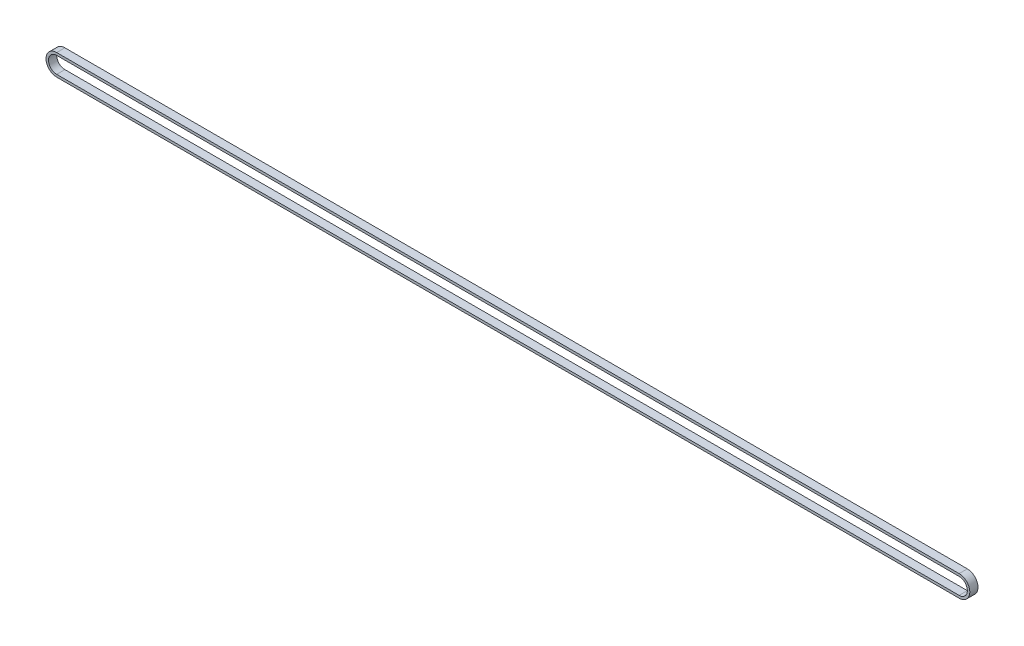
ISO-10303-21;
HEADER;
FILE_DESCRIPTION(('STEP AP214'),'2;1');
FILE_NAME('part.step','',(''),(''),'','','');
FILE_SCHEMA(('AUTOMOTIVE_DESIGN { 1 0 10303 214 1 1 1 1 }'));
ENDSEC;
DATA;
#1=APPLICATION_CONTEXT('core data for automotive mechanical design processes');
#2=APPLICATION_PROTOCOL_DEFINITION('international standard','automotive_design',2000,#1);
#3=PRODUCT_CONTEXT('',#1,'mechanical');
#4=PRODUCT('Part','Part','',(#3));
#5=PRODUCT_RELATED_PRODUCT_CATEGORY('part','',(#4));
#6=PRODUCT_DEFINITION_FORMATION('','',#4);
#7=PRODUCT_DEFINITION_CONTEXT('part definition',#1,'design');
#8=PRODUCT_DEFINITION('design','',#6,#7);
#9=PRODUCT_DEFINITION_SHAPE('','',#8);
#10=(LENGTH_UNIT() NAMED_UNIT(*) SI_UNIT(.MILLI.,.METRE.));
#11=(NAMED_UNIT(*) PLANE_ANGLE_UNIT() SI_UNIT($,.RADIAN.));
#12=(NAMED_UNIT(*) SI_UNIT($,.STERADIAN.) SOLID_ANGLE_UNIT());
#13=UNCERTAINTY_MEASURE_WITH_UNIT(LENGTH_MEASURE(1.E-05),#10,'distance_accuracy_value','');
#14=(GEOMETRIC_REPRESENTATION_CONTEXT(3) GLOBAL_UNCERTAINTY_ASSIGNED_CONTEXT((#13)) GLOBAL_UNIT_ASSIGNED_CONTEXT((#10,
#11,#12)) REPRESENTATION_CONTEXT('',''));
#15=CARTESIAN_POINT('',(0.,0.,0.));
#16=DIRECTION('',(0.,0.,1.));
#17=DIRECTION('',(1.,0.,0.));
#18=AXIS2_PLACEMENT_3D('',#15,#16,#17);
#19=CARTESIAN_POINT('',(-550.,0.,10.));
#20=DIRECTION('',(0.,0.,1.));
#21=DIRECTION('',(1.,0.,0.));
#22=AXIS2_PLACEMENT_3D('',#19,#20,#21);
#23=PLANE('',#22);
#24=CARTESIAN_POINT('',(-550.,0.,10.));
#25=DIRECTION('',(0.,0.,1.));
#26=DIRECTION('',(1.,0.,0.));
#27=AXIS2_PLACEMENT_3D('',#24,#25,#26);
#28=CIRCLE('',#27,13.);
#29=CARTESIAN_POINT('',(-550.,12.9999999999962,10.));
#30=VERTEX_POINT('',#29);
#31=CARTESIAN_POINT('',(-550.000000367736,-13.0000000000038,10.));
#32=VERTEX_POINT('',#31);
#33=EDGE_CURVE('E153',#30,#32,#28,.T.);
#34=ORIENTED_EDGE('',*,*,#33,.T.);
#35=DIRECTION('',(1.,0.,0.));
#36=VECTOR('',#35,1.);
#37=CARTESIAN_POINT('',(-550.000000367736,-13.0000000000038,10.));
#38=LINE('',#37,#36);
#39=CARTESIAN_POINT('',(550.000000478057,-12.9999999999981,10.));
#40=VERTEX_POINT('',#39);
#41=EDGE_CURVE('E157',#32,#40,#38,.T.);
#42=ORIENTED_EDGE('',*,*,#41,.T.);
#43=CARTESIAN_POINT('',(550.,0.,10.));
#44=DIRECTION('',(0.,0.,1.));
#45=DIRECTION('',(1.,0.,0.));
#46=AXIS2_PLACEMENT_3D('',#43,#44,#45);
#47=CIRCLE('',#46,12.9999999999981);
#48=CARTESIAN_POINT('',(550.,12.9999999999962,10.));
#49=VERTEX_POINT('',#48);
#50=EDGE_CURVE('E161',#40,#49,#47,.T.);
#51=ORIENTED_EDGE('',*,*,#50,.T.);
#52=DIRECTION('',(-1.,0.,0.));
#53=VECTOR('',#52,1.);
#54=CARTESIAN_POINT('',(-550.,12.9999999999962,10.));
#55=LINE('',#54,#53);
#56=EDGE_CURVE('E164',#49,#30,#55,.T.);
#57=ORIENTED_EDGE('',*,*,#56,.T.);
#58=EDGE_LOOP('',(#34,#42,#51,#57));
#59=FACE_BOUND('',#58,.T.);
#60=DIRECTION('',(1.,0.,0.));
#61=VECTOR('',#60,1.);
#62=CARTESIAN_POINT('',(-550.000000367736,-10.0000000000038,10.));
#63=LINE('',#62,#61);
#64=CARTESIAN_POINT('',(-550.000000367736,-10.0000000000038,10.));
#65=VERTEX_POINT('',#64);
#66=CARTESIAN_POINT('',(550.000000367736,-10.0000000000038,10.));
#67=VERTEX_POINT('',#66);
#68=EDGE_CURVE('E114',#65,#67,#63,.T.);
#69=ORIENTED_EDGE('',*,*,#68,.F.);
#70=CARTESIAN_POINT('',(-550.,0.,10.));
#71=DIRECTION('',(0.,0.,1.));
#72=DIRECTION('',(1.,0.,0.));
#73=AXIS2_PLACEMENT_3D('',#70,#71,#72);
#74=CIRCLE('',#73,10.);
#75=CARTESIAN_POINT('',(-550.,9.99999999999622,10.));
#76=VERTEX_POINT('',#75);
#77=EDGE_CURVE('E105',#76,#65,#74,.T.);
#78=ORIENTED_EDGE('',*,*,#77,.F.);
#79=DIRECTION('',(-1.,0.,0.));
#80=VECTOR('',#79,1.);
#81=CARTESIAN_POINT('',(-550.,9.99999999999622,10.));
#82=LINE('',#81,#80);
#83=CARTESIAN_POINT('',(550.,9.99999999999624,10.));
#84=VERTEX_POINT('',#83);
#85=EDGE_CURVE('E131',#84,#76,#82,.T.);
#86=ORIENTED_EDGE('',*,*,#85,.F.);
#87=CARTESIAN_POINT('',(550.,0.,10.));
#88=DIRECTION('',(0.,0.,1.));
#89=DIRECTION('',(1.,0.,0.));
#90=AXIS2_PLACEMENT_3D('',#87,#88,#89);
#91=CIRCLE('',#90,10.);
#92=EDGE_CURVE('E127',#67,#84,#91,.T.);
#93=ORIENTED_EDGE('',*,*,#92,.F.);
#94=EDGE_LOOP('',(#69,#78,#86,#93));
#95=FACE_BOUND('',#94,.T.);
#96=ADVANCED_FACE('F39',(#59,#95),#23,.T.);
#97=CARTESIAN_POINT('',(-550.,0.,0.));
#98=DIRECTION('',(0.,0.,1.));
#99=DIRECTION('',(1.,0.,0.));
#100=AXIS2_PLACEMENT_3D('',#97,#98,#99);
#101=PLANE('',#100);
#102=CARTESIAN_POINT('',(-550.,0.,0.));
#103=DIRECTION('',(0.,0.,1.));
#104=DIRECTION('',(1.,0.,0.));
#105=AXIS2_PLACEMENT_3D('',#102,#103,#104);
#106=CIRCLE('',#105,13.);
#107=CARTESIAN_POINT('',(-550.,12.9999999999962,0.));
#108=VERTEX_POINT('',#107);
#109=CARTESIAN_POINT('',(-550.000000367736,-13.0000000000038,0.));
#110=VERTEX_POINT('',#109);
#111=EDGE_CURVE('E123',#108,#110,#106,.T.);
#112=ORIENTED_EDGE('',*,*,#111,.F.);
#113=DIRECTION('',(-1.,0.,0.));
#114=VECTOR('',#113,1.);
#115=CARTESIAN_POINT('',(-550.,12.9999999999962,0.));
#116=LINE('',#115,#114);
#117=CARTESIAN_POINT('',(550.,12.9999999999962,0.));
#118=VERTEX_POINT('',#117);
#119=EDGE_CURVE('E158',#118,#108,#116,.T.);
#120=ORIENTED_EDGE('',*,*,#119,.F.);
#121=CARTESIAN_POINT('',(550.,0.,0.));
#122=DIRECTION('',(0.,0.,1.));
#123=DIRECTION('',(1.,0.,0.));
#124=AXIS2_PLACEMENT_3D('',#121,#122,#123);
#125=CIRCLE('',#124,12.9999999999981);
#126=CARTESIAN_POINT('',(550.000000478057,-12.9999999999981,0.));
#127=VERTEX_POINT('',#126);
#128=EDGE_CURVE('E174',#127,#118,#125,.T.);
#129=ORIENTED_EDGE('',*,*,#128,.F.);
#130=DIRECTION('',(1.,0.,0.));
#131=VECTOR('',#130,1.);
#132=CARTESIAN_POINT('',(-550.000000367736,-13.0000000000038,0.));
#133=LINE('',#132,#131);
#134=EDGE_CURVE('E171',#110,#127,#133,.T.);
#135=ORIENTED_EDGE('',*,*,#134,.F.);
#136=EDGE_LOOP('',(#112,#120,#129,#135));
#137=FACE_BOUND('',#136,.T.);
#138=CARTESIAN_POINT('',(-550.,0.,0.));
#139=DIRECTION('',(0.,0.,1.));
#140=DIRECTION('',(1.,0.,0.));
#141=AXIS2_PLACEMENT_3D('',#138,#139,#140);
#142=CIRCLE('',#141,10.);
#143=CARTESIAN_POINT('',(-550.,9.99999999999622,0.));
#144=VERTEX_POINT('',#143);
#145=CARTESIAN_POINT('',(-550.000000367736,-10.0000000000038,0.));
#146=VERTEX_POINT('',#145);
#147=EDGE_CURVE('E63',#144,#146,#142,.T.);
#148=ORIENTED_EDGE('',*,*,#147,.T.);
#149=DIRECTION('',(1.,0.,0.));
#150=VECTOR('',#149,1.);
#151=CARTESIAN_POINT('',(-550.000000367736,-10.0000000000038,0.));
#152=LINE('',#151,#150);
#153=CARTESIAN_POINT('',(550.000000367736,-10.0000000000038,0.));
#154=VERTEX_POINT('',#153);
#155=EDGE_CURVE('E121',#146,#154,#152,.T.);
#156=ORIENTED_EDGE('',*,*,#155,.T.);
#157=CARTESIAN_POINT('',(550.,0.,0.));
#158=DIRECTION('',(0.,0.,1.));
#159=DIRECTION('',(1.,0.,0.));
#160=AXIS2_PLACEMENT_3D('',#157,#158,#159);
#161=CIRCLE('',#160,10.);
#162=CARTESIAN_POINT('',(550.,10.,0.));
#163=VERTEX_POINT('',#162);
#164=EDGE_CURVE('E140',#154,#163,#161,.T.);
#165=ORIENTED_EDGE('',*,*,#164,.T.);
#166=DIRECTION('',(-1.,0.,0.));
#167=VECTOR('',#166,1.);
#168=CARTESIAN_POINT('',(-550.,9.99999999999622,0.));
#169=LINE('',#168,#167);
#170=EDGE_CURVE('E115',#163,#144,#169,.T.);
#171=ORIENTED_EDGE('',*,*,#170,.T.);
#172=EDGE_LOOP('',(#148,#156,#165,#171));
#173=FACE_BOUND('',#172,.T.);
#174=ADVANCED_FACE('F197',(#137,#173),#101,.F.);
#175=CARTESIAN_POINT('',(-550.,0.,10.));
#176=DIRECTION('',(0.,0.,-1.));
#177=DIRECTION('',(-1.,0.,0.));
#178=AXIS2_PLACEMENT_3D('',#175,#176,#177);
#179=CYLINDRICAL_SURFACE('',#178,13.);
#180=ORIENTED_EDGE('',*,*,#111,.T.);
#181=DIRECTION('',(0.,0.,-1.));
#182=VECTOR('',#181,1.);
#183=CARTESIAN_POINT('',(-550.000000367736,-13.0000000000038,10.));
#184=LINE('',#183,#182);
#185=EDGE_CURVE('E11',#32,#110,#184,.T.);
#186=ORIENTED_EDGE('',*,*,#185,.F.);
#187=ORIENTED_EDGE('',*,*,#33,.F.);
#188=DIRECTION('',(0.,0.,-1.));
#189=VECTOR('',#188,1.);
#190=CARTESIAN_POINT('',(-550.,12.9999999999962,10.));
#191=LINE('',#190,#189);
#192=EDGE_CURVE('E167',#30,#108,#191,.T.);
#193=ORIENTED_EDGE('',*,*,#192,.T.);
#194=EDGE_LOOP('',(#180,#186,#187,#193));
#195=FACE_BOUND('',#194,.T.);
#196=ADVANCED_FACE('F41',(#195),#179,.T.);
#197=CARTESIAN_POINT('',(-550.000000367736,-13.0000000000038,10.));
#198=DIRECTION('',(0.,1.,0.));
#199=DIRECTION('',(-1.,0.,0.));
#200=AXIS2_PLACEMENT_3D('',#197,#198,#199);
#201=PLANE('',#200);
#202=ORIENTED_EDGE('',*,*,#134,.T.);
#203=DIRECTION('',(0.,0.,-1.));
#204=VECTOR('',#203,1.);
#205=CARTESIAN_POINT('',(550.000000478057,-12.9999999999981,10.));
#206=LINE('',#205,#204);
#207=EDGE_CURVE('E48',#40,#127,#206,.T.);
#208=ORIENTED_EDGE('',*,*,#207,.F.);
#209=ORIENTED_EDGE('',*,*,#41,.F.);
#210=ORIENTED_EDGE('',*,*,#185,.T.);
#211=EDGE_LOOP('',(#202,#208,#209,#210));
#212=FACE_BOUND('',#211,.T.);
#213=ADVANCED_FACE('F207',(#212),#201,.F.);
#214=CARTESIAN_POINT('',(550.,0.,10.));
#215=DIRECTION('',(0.,0.,-1.));
#216=DIRECTION('',(-1.,0.,0.));
#217=AXIS2_PLACEMENT_3D('',#214,#215,#216);
#218=CYLINDRICAL_SURFACE('',#217,12.9999999999981);
#219=ORIENTED_EDGE('',*,*,#128,.T.);
#220=DIRECTION('',(0.,0.,-1.));
#221=VECTOR('',#220,1.);
#222=CARTESIAN_POINT('',(550.,12.9999999999962,10.));
#223=LINE('',#222,#221);
#224=EDGE_CURVE('E182',#49,#118,#223,.T.);
#225=ORIENTED_EDGE('',*,*,#224,.F.);
#226=ORIENTED_EDGE('',*,*,#50,.F.);
#227=ORIENTED_EDGE('',*,*,#207,.T.);
#228=EDGE_LOOP('',(#219,#225,#226,#227));
#229=FACE_BOUND('',#228,.T.);
#230=ADVANCED_FACE('F191',(#229),#218,.T.);
#231=CARTESIAN_POINT('',(-550.,12.9999999999962,10.));
#232=DIRECTION('',(0.,-1.,0.));
#233=DIRECTION('',(0.,0.,-1.));
#234=AXIS2_PLACEMENT_3D('',#231,#232,#233);
#235=PLANE('',#234);
#236=ORIENTED_EDGE('',*,*,#119,.T.);
#237=ORIENTED_EDGE('',*,*,#192,.F.);
#238=ORIENTED_EDGE('',*,*,#56,.F.);
#239=ORIENTED_EDGE('',*,*,#224,.T.);
#240=EDGE_LOOP('',(#236,#237,#238,#239));
#241=FACE_BOUND('',#240,.T.);
#242=ADVANCED_FACE('F201',(#241),#235,.F.);
#243=CARTESIAN_POINT('',(-550.,0.,10.));
#244=DIRECTION('',(0.,0.,-1.));
#245=DIRECTION('',(-1.,0.,0.));
#246=AXIS2_PLACEMENT_3D('',#243,#244,#245);
#247=CYLINDRICAL_SURFACE('',#246,10.);
#248=ORIENTED_EDGE('',*,*,#147,.F.);
#249=DIRECTION('',(0.,0.,-1.));
#250=VECTOR('',#249,1.);
#251=CARTESIAN_POINT('',(-550.,9.99999999999622,10.));
#252=LINE('',#251,#250);
#253=EDGE_CURVE('E109',#76,#144,#252,.T.);
#254=ORIENTED_EDGE('',*,*,#253,.F.);
#255=ORIENTED_EDGE('',*,*,#77,.T.);
#256=DIRECTION('',(0.,0.,-1.));
#257=VECTOR('',#256,1.);
#258=CARTESIAN_POINT('',(-550.000000367736,-10.0000000000038,10.));
#259=LINE('',#258,#257);
#260=EDGE_CURVE('E108',#65,#146,#259,.T.);
#261=ORIENTED_EDGE('',*,*,#260,.T.);
#262=EDGE_LOOP('',(#248,#254,#255,#261));
#263=FACE_BOUND('',#262,.T.);
#264=ADVANCED_FACE('F107',(#263),#247,.F.);
#265=CARTESIAN_POINT('',(-550.000000367736,-10.0000000000038,10.));
#266=DIRECTION('',(0.,1.,0.));
#267=DIRECTION('',(-1.,0.,0.));
#268=AXIS2_PLACEMENT_3D('',#265,#266,#267);
#269=PLANE('',#268);
#270=ORIENTED_EDGE('',*,*,#155,.F.);
#271=ORIENTED_EDGE('',*,*,#260,.F.);
#272=ORIENTED_EDGE('',*,*,#68,.T.);
#273=DIRECTION('',(0.,0.,-1.));
#274=VECTOR('',#273,1.);
#275=CARTESIAN_POINT('',(550.000000367736,-10.0000000000038,10.));
#276=LINE('',#275,#274);
#277=EDGE_CURVE('E124',#67,#154,#276,.T.);
#278=ORIENTED_EDGE('',*,*,#277,.T.);
#279=EDGE_LOOP('',(#270,#271,#272,#278));
#280=FACE_BOUND('',#279,.T.);
#281=ADVANCED_FACE('F118',(#280),#269,.T.);
#282=CARTESIAN_POINT('',(550.,0.,10.));
#283=DIRECTION('',(0.,0.,-1.));
#284=DIRECTION('',(-1.,0.,0.));
#285=AXIS2_PLACEMENT_3D('',#282,#283,#284);
#286=CYLINDRICAL_SURFACE('',#285,10.);
#287=ORIENTED_EDGE('',*,*,#164,.F.);
#288=ORIENTED_EDGE('',*,*,#277,.F.);
#289=ORIENTED_EDGE('',*,*,#92,.T.);
#290=DIRECTION('',(0.,0.,-1.));
#291=VECTOR('',#290,1.);
#292=CARTESIAN_POINT('',(550.,10.,10.));
#293=LINE('',#292,#291);
#294=EDGE_CURVE('E55',#84,#163,#293,.T.);
#295=ORIENTED_EDGE('',*,*,#294,.T.);
#296=EDGE_LOOP('',(#287,#288,#289,#295));
#297=FACE_BOUND('',#296,.T.);
#298=ADVANCED_FACE('F230',(#297),#286,.F.);
#299=CARTESIAN_POINT('',(-550.,9.99999999999622,10.));
#300=DIRECTION('',(0.,-1.,0.));
#301=DIRECTION('',(1.,0.,0.));
#302=AXIS2_PLACEMENT_3D('',#299,#300,#301);
#303=PLANE('',#302);
#304=ORIENTED_EDGE('',*,*,#170,.F.);
#305=ORIENTED_EDGE('',*,*,#294,.F.);
#306=ORIENTED_EDGE('',*,*,#85,.T.);
#307=ORIENTED_EDGE('',*,*,#253,.T.);
#308=EDGE_LOOP('',(#304,#305,#306,#307));
#309=FACE_BOUND('',#308,.T.);
#310=ADVANCED_FACE('F234',(#309),#303,.T.);
#311=CLOSED_SHELL('',(#96,#174,#196,#213,#230,#242,#264,#281,#298,#310));
#312=MANIFOLD_SOLID_BREP('B2',#311);
#313=ADVANCED_BREP_SHAPE_REPRESENTATION('',(#18,#312),#14);
#314=SHAPE_DEFINITION_REPRESENTATION(#9,#313);
ENDSEC;
END-ISO-10303-21;
